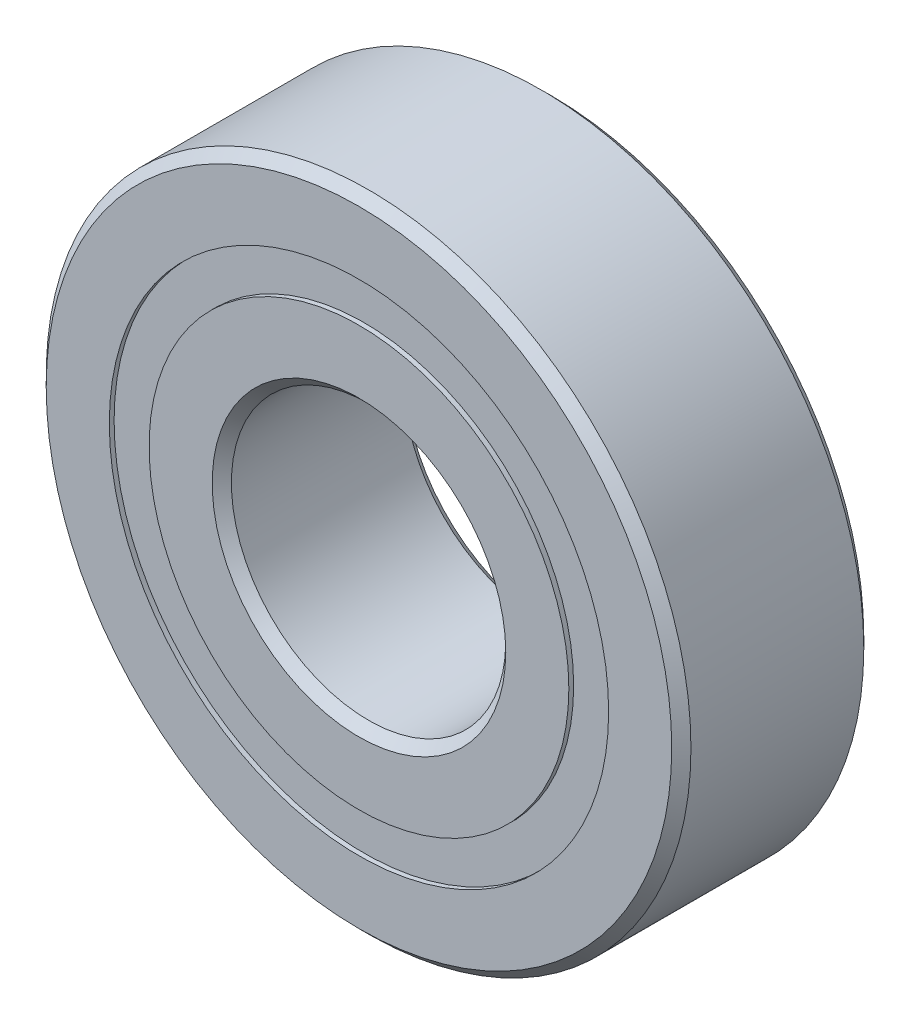
ISO-10303-21;
HEADER;
FILE_DESCRIPTION(('STEP AP214'),'2;1');
FILE_NAME('part.step','',(''),(''),'','','');
FILE_SCHEMA(('AUTOMOTIVE_DESIGN { 1 0 10303 214 1 1 1 1 }'));
ENDSEC;
DATA;
#1=APPLICATION_CONTEXT('core data for automotive mechanical design processes');
#2=APPLICATION_PROTOCOL_DEFINITION('international standard','automotive_design',2000,#1);
#3=PRODUCT_CONTEXT('',#1,'mechanical');
#4=PRODUCT('Part','Part','',(#3));
#5=PRODUCT_RELATED_PRODUCT_CATEGORY('part','',(#4));
#6=PRODUCT_DEFINITION_FORMATION('','',#4);
#7=PRODUCT_DEFINITION_CONTEXT('part definition',#1,'design');
#8=PRODUCT_DEFINITION('design','',#6,#7);
#9=PRODUCT_DEFINITION_SHAPE('','',#8);
#10=(LENGTH_UNIT() NAMED_UNIT(*) SI_UNIT(.MILLI.,.METRE.));
#11=(NAMED_UNIT(*) PLANE_ANGLE_UNIT() SI_UNIT($,.RADIAN.));
#12=(NAMED_UNIT(*) SI_UNIT($,.STERADIAN.) SOLID_ANGLE_UNIT());
#13=UNCERTAINTY_MEASURE_WITH_UNIT(LENGTH_MEASURE(1.E-05),#10,'distance_accuracy_value','');
#14=(GEOMETRIC_REPRESENTATION_CONTEXT(3) GLOBAL_UNCERTAINTY_ASSIGNED_CONTEXT((#13)) GLOBAL_UNIT_ASSIGNED_CONTEXT((#10,
#11,#12)) REPRESENTATION_CONTEXT('',''));
#15=CARTESIAN_POINT('',(0.,0.,0.));
#16=DIRECTION('',(0.,0.,1.));
#17=DIRECTION('',(1.,0.,0.));
#18=AXIS2_PLACEMENT_3D('',#15,#16,#17);
#19=CARTESIAN_POINT('',(0.,18.2005494505494,-6.65));
#20=DIRECTION('',(0.,0.,1.));
#21=DIRECTION('',(1.,0.,0.));
#22=AXIS2_PLACEMENT_3D('',#19,#20,#21);
#23=PLANE('',#22);
#24=CARTESIAN_POINT('',(0.,0.,-6.65));
#25=DIRECTION('',(0.,0.,1.));
#26=DIRECTION('',(1.,0.,0.));
#27=AXIS2_PLACEMENT_3D('',#24,#25,#26);
#28=CIRCLE('',#27,18.2005494505494);
#29=CARTESIAN_POINT('',(18.2005494505494,0.,-6.65));
#30=VERTEX_POINT('',#29);
#31=EDGE_CURVE('E59',#30,#30,#28,.T.);
#32=ORIENTED_EDGE('',*,*,#31,.F.);
#33=EDGE_LOOP('',(#32));
#34=FACE_BOUND('',#33,.T.);
#35=CARTESIAN_POINT('',(0.,0.,-6.65));
#36=DIRECTION('',(0.,0.,1.));
#37=DIRECTION('',(1.,0.,0.));
#38=AXIS2_PLACEMENT_3D('',#35,#36,#37);
#39=CIRCLE('',#38,15.2994505494506);
#40=CARTESIAN_POINT('',(15.2994505494506,0.,-6.65));
#41=VERTEX_POINT('',#40);
#42=EDGE_CURVE('E11',#41,#41,#39,.T.);
#43=ORIENTED_EDGE('',*,*,#42,.T.);
#44=EDGE_LOOP('',(#43));
#45=FACE_BOUND('',#44,.T.);
#46=ADVANCED_FACE('F45',(#34,#45),#23,.F.);
#47=CARTESIAN_POINT('',(0.,0.,7.));
#48=DIRECTION('',(0.,0.,1.));
#49=DIRECTION('',(1.,0.,0.));
#50=AXIS2_PLACEMENT_3D('',#47,#48,#49);
#51=CYLINDRICAL_SURFACE('',#50,15.2994505494506);
#52=ORIENTED_EDGE('',*,*,#42,.F.);
#53=EDGE_LOOP('',(#52));
#54=FACE_BOUND('',#53,.T.);
#55=CARTESIAN_POINT('',(0.,0.,-3.43265291781274));
#56=DIRECTION('',(0.,0.,1.));
#57=DIRECTION('',(1.,0.,0.));
#58=AXIS2_PLACEMENT_3D('',#55,#56,#57);
#59=CIRCLE('',#58,15.2994505494506);
#60=CARTESIAN_POINT('',(15.2994505494506,0.,-3.43265291781274));
#61=VERTEX_POINT('',#60);
#62=EDGE_CURVE('E51',#61,#61,#59,.T.);
#63=ORIENTED_EDGE('',*,*,#62,.T.);
#64=EDGE_LOOP('',(#63));
#65=FACE_BOUND('',#64,.T.);
#66=ADVANCED_FACE('F68',(#54,#65),#51,.F.);
#67=CARTESIAN_POINT('',(0.,18.2005494505495,-3.43265291781274));
#68=DIRECTION('',(0.,0.,-1.));
#69=DIRECTION('',(-1.,0.,0.));
#70=AXIS2_PLACEMENT_3D('',#67,#68,#69);
#71=PLANE('',#70);
#72=ORIENTED_EDGE('',*,*,#62,.F.);
#73=EDGE_LOOP('',(#72));
#74=FACE_BOUND('',#73,.T.);
#75=CARTESIAN_POINT('',(0.,0.,-3.43265291781274));
#76=DIRECTION('',(0.,0.,1.));
#77=DIRECTION('',(1.,0.,0.));
#78=AXIS2_PLACEMENT_3D('',#75,#76,#77);
#79=CIRCLE('',#78,18.2005494505495);
#80=CARTESIAN_POINT('',(18.2005494505495,0.,-3.43265291781274));
#81=VERTEX_POINT('',#80);
#82=EDGE_CURVE('E55',#81,#81,#79,.T.);
#83=ORIENTED_EDGE('',*,*,#82,.T.);
#84=EDGE_LOOP('',(#83));
#85=FACE_BOUND('',#84,.T.);
#86=ADVANCED_FACE('F72',(#74,#85),#71,.F.);
#87=CARTESIAN_POINT('',(0.,0.,7.));
#88=DIRECTION('',(0.,0.,1.));
#89=DIRECTION('',(1.,0.,0.));
#90=AXIS2_PLACEMENT_3D('',#87,#88,#89);
#91=CYLINDRICAL_SURFACE('',#90,18.2005494505494);
#92=ORIENTED_EDGE('',*,*,#82,.F.);
#93=EDGE_LOOP('',(#92));
#94=FACE_BOUND('',#93,.T.);
#95=ORIENTED_EDGE('',*,*,#31,.T.);
#96=EDGE_LOOP('',(#95));
#97=FACE_BOUND('',#96,.T.);
#98=ADVANCED_FACE('F65',(#94,#97),#91,.T.);
#99=CLOSED_SHELL('',(#46,#66,#86,#98));
#100=MANIFOLD_SOLID_BREP('B2',#99);
#101=CARTESIAN_POINT('',(0.,18.2005494505495,6.65));
#102=DIRECTION('',(0.,0.,-1.));
#103=DIRECTION('',(-1.,0.,0.));
#104=AXIS2_PLACEMENT_3D('',#101,#102,#103);
#105=PLANE('',#104);
#106=CARTESIAN_POINT('',(0.,0.,6.65));
#107=DIRECTION('',(0.,0.,1.));
#108=DIRECTION('',(1.,0.,0.));
#109=AXIS2_PLACEMENT_3D('',#106,#107,#108);
#110=CIRCLE('',#109,15.2994505494506);
#111=CARTESIAN_POINT('',(15.2994505494506,0.,6.65));
#112=VERTEX_POINT('',#111);
#113=EDGE_CURVE('E44',#112,#112,#110,.T.);
#114=ORIENTED_EDGE('',*,*,#113,.F.);
#115=EDGE_LOOP('',(#114));
#116=FACE_BOUND('',#115,.T.);
#117=CARTESIAN_POINT('',(0.,0.,6.65));
#118=DIRECTION('',(0.,0.,1.));
#119=DIRECTION('',(1.,0.,0.));
#120=AXIS2_PLACEMENT_3D('',#117,#118,#119);
#121=CIRCLE('',#120,18.2005494505495);
#122=CARTESIAN_POINT('',(18.2005494505495,0.,6.65));
#123=VERTEX_POINT('',#122);
#124=EDGE_CURVE('E126',#123,#123,#121,.T.);
#125=ORIENTED_EDGE('',*,*,#124,.T.);
#126=EDGE_LOOP('',(#125));
#127=FACE_BOUND('',#126,.T.);
#128=ADVANCED_FACE('F112',(#116,#127),#105,.F.);
#129=CARTESIAN_POINT('',(0.,0.,7.));
#130=DIRECTION('',(0.,0.,1.));
#131=DIRECTION('',(1.,0.,0.));
#132=AXIS2_PLACEMENT_3D('',#129,#130,#131);
#133=CYLINDRICAL_SURFACE('',#132,15.2994505494506);
#134=CARTESIAN_POINT('',(0.,0.,3.43265291781274));
#135=DIRECTION('',(0.,0.,1.));
#136=DIRECTION('',(1.,0.,0.));
#137=AXIS2_PLACEMENT_3D('',#134,#135,#136);
#138=CIRCLE('',#137,15.2994505494506);
#139=CARTESIAN_POINT('',(15.2994505494506,0.,3.43265291781274));
#140=VERTEX_POINT('',#139);
#141=EDGE_CURVE('E118',#140,#140,#138,.T.);
#142=ORIENTED_EDGE('',*,*,#141,.F.);
#143=EDGE_LOOP('',(#142));
#144=FACE_BOUND('',#143,.T.);
#145=ORIENTED_EDGE('',*,*,#113,.T.);
#146=EDGE_LOOP('',(#145));
#147=FACE_BOUND('',#146,.T.);
#148=ADVANCED_FACE('F141',(#144,#147),#133,.F.);
#149=CARTESIAN_POINT('',(0.,18.2005494505495,3.43265291781274));
#150=DIRECTION('',(0.,0.,1.));
#151=DIRECTION('',(1.,0.,0.));
#152=AXIS2_PLACEMENT_3D('',#149,#150,#151);
#153=PLANE('',#152);
#154=CARTESIAN_POINT('',(0.,0.,3.43265291781274));
#155=DIRECTION('',(0.,0.,1.));
#156=DIRECTION('',(1.,0.,0.));
#157=AXIS2_PLACEMENT_3D('',#154,#155,#156);
#158=CIRCLE('',#157,18.2005494505495);
#159=CARTESIAN_POINT('',(18.2005494505495,0.,3.43265291781274));
#160=VERTEX_POINT('',#159);
#161=EDGE_CURVE('E122',#160,#160,#158,.T.);
#162=ORIENTED_EDGE('',*,*,#161,.F.);
#163=EDGE_LOOP('',(#162));
#164=FACE_BOUND('',#163,.T.);
#165=ORIENTED_EDGE('',*,*,#141,.T.);
#166=EDGE_LOOP('',(#165));
#167=FACE_BOUND('',#166,.T.);
#168=ADVANCED_FACE('F136',(#164,#167),#153,.F.);
#169=CARTESIAN_POINT('',(0.,0.,7.));
#170=DIRECTION('',(0.,0.,1.));
#171=DIRECTION('',(1.,0.,0.));
#172=AXIS2_PLACEMENT_3D('',#169,#170,#171);
#173=CYLINDRICAL_SURFACE('',#172,18.2005494505495);
#174=ORIENTED_EDGE('',*,*,#124,.F.);
#175=EDGE_LOOP('',(#174));
#176=FACE_BOUND('',#175,.T.);
#177=ORIENTED_EDGE('',*,*,#161,.T.);
#178=EDGE_LOOP('',(#177));
#179=FACE_BOUND('',#178,.T.);
#180=ADVANCED_FACE('F133',(#176,#179),#173,.T.);
#181=CLOSED_SHELL('',(#128,#148,#168,#180));
#182=MANIFOLD_SOLID_BREP('B6',#181);
#183=CARTESIAN_POINT('',(-8.37499999999982,14.5059255133895,0.));
#184=DIRECTION('',(0.,0.,1.));
#185=DIRECTION('',(-0.499999999999989,0.866025403784445,0.));
#186=AXIS2_PLACEMENT_3D('',#183,#184,#185);
#187=SPHERICAL_SURFACE('',#186,3.43265291781274);
#188=CARTESIAN_POINT('',(-8.37499999999982,14.5059255133895,3.43265291781274));
#189=VERTEX_POINT('',#188);
#190=VERTEX_LOOP('',#189);
#191=FACE_BOUND('',#190,.T.);
#192=ADVANCED_FACE('F179',(#191),#187,.T.);
#193=CLOSED_SHELL('',(#192));
#194=MANIFOLD_SOLID_BREP('B39',#193);
#195=CARTESIAN_POINT('',(-14.5059255133893,8.37500000000017,0.));
#196=DIRECTION('',(0.,0.,1.));
#197=DIRECTION('',(-0.866025403784433,0.50000000000001,0.));
#198=AXIS2_PLACEMENT_3D('',#195,#196,#197);
#199=SPHERICAL_SURFACE('',#198,3.43265291781274);
#200=CARTESIAN_POINT('',(-14.5059255133893,8.37500000000017,3.43265291781274));
#201=VERTEX_POINT('',#200);
#202=VERTEX_LOOP('',#201);
#203=FACE_BOUND('',#202,.T.);
#204=ADVANCED_FACE('F199',(#203),#199,.T.);
#205=CLOSED_SHELL('',(#204));
#206=MANIFOLD_SOLID_BREP('B108',#205);
#207=CARTESIAN_POINT('',(-16.75,1.75446937276867E-13,0.));
#208=DIRECTION('',(0.,0.,1.));
#209=DIRECTION('',(-1.,0.,0.));
#210=AXIS2_PLACEMENT_3D('',#207,#208,#209);
#211=SPHERICAL_SURFACE('',#210,3.43265291781274);
#212=CARTESIAN_POINT('',(-16.75,1.75446937276867E-13,3.43265291781274));
#213=VERTEX_POINT('',#212);
#214=VERTEX_LOOP('',#213);
#215=FACE_BOUND('',#214,.T.);
#216=ADVANCED_FACE('F219',(#215),#211,.T.);
#217=CLOSED_SHELL('',(#216));
#218=MANIFOLD_SOLID_BREP('B175',#217);
#219=CARTESIAN_POINT('',(-14.5059255133894,-8.37499999999986,0.));
#220=DIRECTION('',(0.,0.,1.));
#221=DIRECTION('',(-0.866025403784443,-0.499999999999992,0.));
#222=AXIS2_PLACEMENT_3D('',#219,#220,#221);
#223=SPHERICAL_SURFACE('',#222,3.43265291781274);
#224=CARTESIAN_POINT('',(-14.5059255133894,-8.37499999999986,3.43265291781274));
#225=VERTEX_POINT('',#224);
#226=VERTEX_LOOP('',#225);
#227=FACE_BOUND('',#226,.T.);
#228=ADVANCED_FACE('F239',(#227),#223,.T.);
#229=CLOSED_SHELL('',(#228));
#230=MANIFOLD_SOLID_BREP('B195',#229);
#231=CARTESIAN_POINT('',(-8.37500000000012,-14.5059255133893,0.));
#232=DIRECTION('',(0.,0.,1.));
#233=DIRECTION('',(-0.500000000000007,-0.866025403784435,0.));
#234=AXIS2_PLACEMENT_3D('',#231,#232,#233);
#235=SPHERICAL_SURFACE('',#234,3.43265291781274);
#236=CARTESIAN_POINT('',(-8.37500000000012,-14.5059255133893,3.43265291781274));
#237=VERTEX_POINT('',#236);
#238=VERTEX_LOOP('',#237);
#239=FACE_BOUND('',#238,.T.);
#240=ADVANCED_FACE('F259',(#239),#235,.T.);
#241=CLOSED_SHELL('',(#240));
#242=MANIFOLD_SOLID_BREP('B215',#241);
#243=CARTESIAN_POINT('',(-1.16964624851245E-13,-16.75,0.));
#244=DIRECTION('',(0.,0.,1.));
#245=DIRECTION('',(0.,-1.,0.));
#246=AXIS2_PLACEMENT_3D('',#243,#244,#245);
#247=SPHERICAL_SURFACE('',#246,3.43265291781274);
#248=CARTESIAN_POINT('',(-1.16964624851245E-13,-16.75,3.43265291781274));
#249=VERTEX_POINT('',#248);
#250=VERTEX_LOOP('',#249);
#251=FACE_BOUND('',#250,.T.);
#252=ADVANCED_FACE('F279',(#251),#247,.T.);
#253=CLOSED_SHELL('',(#252));
#254=MANIFOLD_SOLID_BREP('B235',#253);
#255=CARTESIAN_POINT('',(8.37499999999991,-14.5059255133894,0.));
#256=DIRECTION('',(0.,0.,1.));
#257=DIRECTION('',(0.499999999999995,-0.866025403784442,0.));
#258=AXIS2_PLACEMENT_3D('',#255,#256,#257);
#259=SPHERICAL_SURFACE('',#258,3.43265291781274);
#260=CARTESIAN_POINT('',(8.37499999999991,-14.5059255133894,3.43265291781274));
#261=VERTEX_POINT('',#260);
#262=VERTEX_LOOP('',#261);
#263=FACE_BOUND('',#262,.T.);
#264=ADVANCED_FACE('F299',(#263),#259,.T.);
#265=CLOSED_SHELL('',(#264));
#266=MANIFOLD_SOLID_BREP('B255',#265);
#267=CARTESIAN_POINT('',(14.5059255133893,-8.37500000000007,0.));
#268=DIRECTION('',(0.,0.,1.));
#269=DIRECTION('',(0.866025403784436,-0.500000000000004,0.));
#270=AXIS2_PLACEMENT_3D('',#267,#268,#269);
#271=SPHERICAL_SURFACE('',#270,3.43265291781274);
#272=CARTESIAN_POINT('',(14.5059255133893,-8.37500000000007,3.43265291781274));
#273=VERTEX_POINT('',#272);
#274=VERTEX_LOOP('',#273);
#275=FACE_BOUND('',#274,.T.);
#276=ADVANCED_FACE('F319',(#275),#271,.T.);
#277=CLOSED_SHELL('',(#276));
#278=MANIFOLD_SOLID_BREP('B275',#277);
#279=CARTESIAN_POINT('',(16.75,0.,0.));
#280=DIRECTION('',(0.,0.,1.));
#281=DIRECTION('',(1.,0.,0.));
#282=AXIS2_PLACEMENT_3D('',#279,#280,#281);
#283=SPHERICAL_SURFACE('',#282,3.43265291781274);
#284=CARTESIAN_POINT('',(16.75,0.,3.43265291781274));
#285=VERTEX_POINT('',#284);
#286=VERTEX_LOOP('',#285);
#287=FACE_BOUND('',#286,.T.);
#288=ADVANCED_FACE('F339',(#287),#283,.T.);
#289=CLOSED_SHELL('',(#288));
#290=MANIFOLD_SOLID_BREP('B295',#289);
#291=CARTESIAN_POINT('',(14.5059255133894,8.37499999999997,0.));
#292=DIRECTION('',(0.,0.,1.));
#293=DIRECTION('',(0.86602540378444,0.499999999999998,0.));
#294=AXIS2_PLACEMENT_3D('',#291,#292,#293);
#295=SPHERICAL_SURFACE('',#294,3.43265291781274);
#296=CARTESIAN_POINT('',(14.5059255133894,8.37499999999997,3.43265291781274));
#297=VERTEX_POINT('',#296);
#298=VERTEX_LOOP('',#297);
#299=FACE_BOUND('',#298,.T.);
#300=ADVANCED_FACE('F359',(#299),#295,.T.);
#301=CLOSED_SHELL('',(#300));
#302=MANIFOLD_SOLID_BREP('B315',#301);
#303=CARTESIAN_POINT('',(8.37500000000002,14.5059255133893,0.));
#304=DIRECTION('',(0.,0.,1.));
#305=DIRECTION('',(0.500000000000001,0.866025403784438,0.));
#306=AXIS2_PLACEMENT_3D('',#303,#304,#305);
#307=SPHERICAL_SURFACE('',#306,3.43265291781274);
#308=CARTESIAN_POINT('',(8.37500000000002,14.5059255133893,3.43265291781274));
#309=VERTEX_POINT('',#308);
#310=VERTEX_LOOP('',#309);
#311=FACE_BOUND('',#310,.T.);
#312=ADVANCED_FACE('F379',(#311),#307,.T.);
#313=CLOSED_SHELL('',(#312));
#314=MANIFOLD_SOLID_BREP('B335',#313);
#315=CARTESIAN_POINT('',(0.,16.75,0.));
#316=DIRECTION('',(0.,0.,1.));
#317=DIRECTION('',(0.,1.,0.));
#318=AXIS2_PLACEMENT_3D('',#315,#316,#317);
#319=SPHERICAL_SURFACE('',#318,3.43265291781274);
#320=CARTESIAN_POINT('',(0.,16.75,3.43265291781274));
#321=VERTEX_POINT('',#320);
#322=VERTEX_LOOP('',#321);
#323=FACE_BOUND('',#322,.T.);
#324=ADVANCED_FACE('F401',(#323),#319,.T.);
#325=CLOSED_SHELL('',(#324));
#326=MANIFOLD_SOLID_BREP('B355',#325);
#327=CARTESIAN_POINT('',(0.,15.2994505494506,7.));
#328=DIRECTION('',(0.,0.,-1.));
#329=DIRECTION('',(-1.,0.,0.));
#330=AXIS2_PLACEMENT_3D('',#327,#328,#329);
#331=PLANE('',#330);
#332=CARTESIAN_POINT('',(0.,0.,7.));
#333=DIRECTION('',(0.,0.,1.));
#334=DIRECTION('',(1.,0.,0.));
#335=AXIS2_PLACEMENT_3D('',#332,#333,#334);
#336=CIRCLE('',#335,10.7);
#337=CARTESIAN_POINT('',(10.7,0.,7.));
#338=VERTEX_POINT('',#337);
#339=EDGE_CURVE('E448',#338,#338,#336,.T.);
#340=ORIENTED_EDGE('',*,*,#339,.F.);
#341=EDGE_LOOP('',(#340));
#342=FACE_BOUND('',#341,.T.);
#343=CARTESIAN_POINT('',(0.,0.,7.));
#344=DIRECTION('',(0.,0.,1.));
#345=DIRECTION('',(1.,0.,0.));
#346=AXIS2_PLACEMENT_3D('',#343,#344,#345);
#347=CIRCLE('',#346,15.2994505494506);
#348=CARTESIAN_POINT('',(15.2994505494506,0.,7.));
#349=VERTEX_POINT('',#348);
#350=EDGE_CURVE('E400',#349,#349,#347,.T.);
#351=ORIENTED_EDGE('',*,*,#350,.T.);
#352=EDGE_LOOP('',(#351));
#353=FACE_BOUND('',#352,.T.);
#354=ADVANCED_FACE('F420',(#342,#353),#331,.F.);
#355=CARTESIAN_POINT('',(0.,0.,7.));
#356=DIRECTION('',(0.,0.,1.));
#357=DIRECTION('',(1.,0.,0.));
#358=AXIS2_PLACEMENT_3D('',#355,#356,#357);
#359=CYLINDRICAL_SURFACE('',#358,15.2994505494506);
#360=ORIENTED_EDGE('',*,*,#350,.F.);
#361=EDGE_LOOP('',(#360));
#362=FACE_BOUND('',#361,.T.);
#363=CARTESIAN_POINT('',(0.,0.,3.11111111111111));
#364=DIRECTION('',(0.,0.,1.));
#365=DIRECTION('',(1.,0.,0.));
#366=AXIS2_PLACEMENT_3D('',#363,#364,#365);
#367=CIRCLE('',#366,15.2994505494506);
#368=CARTESIAN_POINT('',(15.2994505494506,0.,3.11111111111111));
#369=VERTEX_POINT('',#368);
#370=EDGE_CURVE('E426',#369,#369,#367,.T.);
#371=ORIENTED_EDGE('',*,*,#370,.T.);
#372=EDGE_LOOP('',(#371));
#373=FACE_BOUND('',#372,.T.);
#374=ADVANCED_FACE('F455',(#362,#373),#359,.T.);
#375=CARTESIAN_POINT('',(0.,0.,0.));
#376=DIRECTION('',(0.,0.,1.));
#377=DIRECTION('',(1.,0.,0.));
#378=AXIS2_PLACEMENT_3D('',#375,#376,#377);
#379=TOROIDAL_SURFACE('',#378,16.75,3.43265291781274);
#380=ORIENTED_EDGE('',*,*,#370,.F.);
#381=EDGE_LOOP('',(#380));
#382=FACE_BOUND('',#381,.T.);
#383=CARTESIAN_POINT('',(0.,0.,-3.11111111111112));
#384=DIRECTION('',(0.,0.,1.));
#385=DIRECTION('',(1.,0.,0.));
#386=AXIS2_PLACEMENT_3D('',#383,#384,#385);
#387=CIRCLE('',#386,15.2994505494506);
#388=CARTESIAN_POINT('',(15.2994505494506,0.,-3.11111111111112));
#389=VERTEX_POINT('',#388);
#390=EDGE_CURVE('E430',#389,#389,#387,.T.);
#391=ORIENTED_EDGE('',*,*,#390,.T.);
#392=EDGE_LOOP('',(#391));
#393=FACE_BOUND('',#392,.T.);
#394=ADVANCED_FACE('F459',(#382,#393),#379,.F.);
#395=CARTESIAN_POINT('',(0.,0.,7.));
#396=DIRECTION('',(0.,0.,1.));
#397=DIRECTION('',(1.,0.,0.));
#398=AXIS2_PLACEMENT_3D('',#395,#396,#397);
#399=CYLINDRICAL_SURFACE('',#398,15.2994505494506);
#400=ORIENTED_EDGE('',*,*,#390,.F.);
#401=EDGE_LOOP('',(#400));
#402=FACE_BOUND('',#401,.T.);
#403=CARTESIAN_POINT('',(0.,0.,-7.));
#404=DIRECTION('',(0.,0.,1.));
#405=DIRECTION('',(1.,0.,0.));
#406=AXIS2_PLACEMENT_3D('',#403,#404,#405);
#407=CIRCLE('',#406,15.2994505494506);
#408=CARTESIAN_POINT('',(15.2994505494506,0.,-7.));
#409=VERTEX_POINT('',#408);
#410=EDGE_CURVE('E434',#409,#409,#407,.T.);
#411=ORIENTED_EDGE('',*,*,#410,.T.);
#412=EDGE_LOOP('',(#411));
#413=FACE_BOUND('',#412,.T.);
#414=ADVANCED_FACE('F464',(#402,#413),#399,.T.);
#415=CARTESIAN_POINT('',(0.,10.7,-7.));
#416=DIRECTION('',(0.,0.,1.));
#417=DIRECTION('',(1.,0.,0.));
#418=AXIS2_PLACEMENT_3D('',#415,#416,#417);
#419=PLANE('',#418);
#420=ORIENTED_EDGE('',*,*,#410,.F.);
#421=EDGE_LOOP('',(#420));
#422=FACE_BOUND('',#421,.T.);
#423=CARTESIAN_POINT('',(0.,0.,-7.));
#424=DIRECTION('',(0.,0.,1.));
#425=DIRECTION('',(1.,0.,0.));
#426=AXIS2_PLACEMENT_3D('',#423,#424,#425);
#427=CIRCLE('',#426,10.7);
#428=CARTESIAN_POINT('',(10.7,0.,-7.));
#429=VERTEX_POINT('',#428);
#430=EDGE_CURVE('E439',#429,#429,#427,.T.);
#431=ORIENTED_EDGE('',*,*,#430,.T.);
#432=EDGE_LOOP('',(#431));
#433=FACE_BOUND('',#432,.T.);
#434=ADVANCED_FACE('F470',(#422,#433),#419,.F.);
#435=CARTESIAN_POINT('',(0.,0.,-6.3));
#436=DIRECTION('',(0.,0.,-1.));
#437=DIRECTION('',(-1.,0.,0.));
#438=AXIS2_PLACEMENT_3D('',#435,#436,#437);
#439=CONICAL_SURFACE('',#438,10.,0.785398163397446);
#440=ORIENTED_EDGE('',*,*,#430,.F.);
#441=EDGE_LOOP('',(#440));
#442=FACE_BOUND('',#441,.T.);
#443=CARTESIAN_POINT('',(0.,0.,-6.3));
#444=DIRECTION('',(0.,0.,1.));
#445=DIRECTION('',(1.,0.,0.));
#446=AXIS2_PLACEMENT_3D('',#443,#444,#445);
#447=CIRCLE('',#446,10.);
#448=CARTESIAN_POINT('',(10.,0.,-6.3));
#449=VERTEX_POINT('',#448);
#450=EDGE_CURVE('E442',#449,#449,#447,.T.);
#451=ORIENTED_EDGE('',*,*,#450,.T.);
#452=EDGE_LOOP('',(#451));
#453=FACE_BOUND('',#452,.T.);
#454=ADVANCED_FACE('F474',(#442,#453),#439,.F.);
#455=CARTESIAN_POINT('',(0.,0.,7.));
#456=DIRECTION('',(0.,0.,1.));
#457=DIRECTION('',(1.,0.,0.));
#458=AXIS2_PLACEMENT_3D('',#455,#456,#457);
#459=CYLINDRICAL_SURFACE('',#458,10.);
#460=ORIENTED_EDGE('',*,*,#450,.F.);
#461=EDGE_LOOP('',(#460));
#462=FACE_BOUND('',#461,.T.);
#463=CARTESIAN_POINT('',(0.,0.,6.3));
#464=DIRECTION('',(0.,0.,1.));
#465=DIRECTION('',(1.,0.,0.));
#466=AXIS2_PLACEMENT_3D('',#463,#464,#465);
#467=CIRCLE('',#466,10.);
#468=CARTESIAN_POINT('',(10.,0.,6.3));
#469=VERTEX_POINT('',#468);
#470=EDGE_CURVE('E445',#469,#469,#467,.T.);
#471=ORIENTED_EDGE('',*,*,#470,.T.);
#472=EDGE_LOOP('',(#471));
#473=FACE_BOUND('',#472,.T.);
#474=ADVANCED_FACE('F478',(#462,#473),#459,.F.);
#475=CARTESIAN_POINT('',(0.,0.,7.));
#476=DIRECTION('',(0.,0.,1.));
#477=DIRECTION('',(1.,0.,0.));
#478=AXIS2_PLACEMENT_3D('',#475,#476,#477);
#479=CONICAL_SURFACE('',#478,10.7,0.78539816339745);
#480=ORIENTED_EDGE('',*,*,#470,.F.);
#481=EDGE_LOOP('',(#480));
#482=FACE_BOUND('',#481,.T.);
#483=ORIENTED_EDGE('',*,*,#339,.T.);
#484=EDGE_LOOP('',(#483));
#485=FACE_BOUND('',#484,.T.);
#486=ADVANCED_FACE('F452',(#482,#485),#479,.F.);
#487=CLOSED_SHELL('',(#354,#374,#394,#414,#434,#454,#474,#486));
#488=MANIFOLD_SOLID_BREP('B375',#487);
#489=CARTESIAN_POINT('',(0.,0.,6.3));
#490=DIRECTION('',(0.,0.,-1.));
#491=DIRECTION('',(-1.,0.,0.));
#492=AXIS2_PLACEMENT_3D('',#489,#490,#491);
#493=CONICAL_SURFACE('',#492,23.5,0.785398163397445);
#494=CARTESIAN_POINT('',(0.,0.,7.));
#495=DIRECTION('',(0.,0.,1.));
#496=DIRECTION('',(1.,0.,0.));
#497=AXIS2_PLACEMENT_3D('',#494,#495,#496);
#498=CIRCLE('',#497,22.8);
#499=CARTESIAN_POINT('',(22.8,0.,7.));
#500=VERTEX_POINT('',#499);
#501=EDGE_CURVE('E569',#500,#500,#498,.T.);
#502=ORIENTED_EDGE('',*,*,#501,.F.);
#503=EDGE_LOOP('',(#502));
#504=FACE_BOUND('',#503,.T.);
#505=CARTESIAN_POINT('',(0.,0.,6.3));
#506=DIRECTION('',(0.,0.,1.));
#507=DIRECTION('',(1.,0.,0.));
#508=AXIS2_PLACEMENT_3D('',#505,#506,#507);
#509=CIRCLE('',#508,23.5);
#510=CARTESIAN_POINT('',(23.5,0.,6.3));
#511=VERTEX_POINT('',#510);
#512=EDGE_CURVE('E419',#511,#511,#509,.T.);
#513=ORIENTED_EDGE('',*,*,#512,.T.);
#514=EDGE_LOOP('',(#513));
#515=FACE_BOUND('',#514,.T.);
#516=ADVANCED_FACE('F541',(#504,#515),#493,.T.);
#517=CARTESIAN_POINT('',(0.,0.,7.));
#518=DIRECTION('',(0.,0.,1.));
#519=DIRECTION('',(1.,0.,0.));
#520=AXIS2_PLACEMENT_3D('',#517,#518,#519);
#521=CYLINDRICAL_SURFACE('',#520,23.5);
#522=ORIENTED_EDGE('',*,*,#512,.F.);
#523=EDGE_LOOP('',(#522));
#524=FACE_BOUND('',#523,.T.);
#525=CARTESIAN_POINT('',(0.,0.,-6.3));
#526=DIRECTION('',(0.,0.,1.));
#527=DIRECTION('',(1.,0.,0.));
#528=AXIS2_PLACEMENT_3D('',#525,#526,#527);
#529=CIRCLE('',#528,23.5);
#530=CARTESIAN_POINT('',(23.5,0.,-6.3));
#531=VERTEX_POINT('',#530);
#532=EDGE_CURVE('E547',#531,#531,#529,.T.);
#533=ORIENTED_EDGE('',*,*,#532,.T.);
#534=EDGE_LOOP('',(#533));
#535=FACE_BOUND('',#534,.T.);
#536=ADVANCED_FACE('F576',(#524,#535),#521,.T.);
#537=CARTESIAN_POINT('',(0.,0.,-7.));
#538=DIRECTION('',(0.,0.,1.));
#539=DIRECTION('',(1.,0.,0.));
#540=AXIS2_PLACEMENT_3D('',#537,#538,#539);
#541=CONICAL_SURFACE('',#540,22.8,0.785398163397446);
#542=ORIENTED_EDGE('',*,*,#532,.F.);
#543=EDGE_LOOP('',(#542));
#544=FACE_BOUND('',#543,.T.);
#545=CARTESIAN_POINT('',(0.,0.,-7.));
#546=DIRECTION('',(0.,0.,1.));
#547=DIRECTION('',(1.,0.,0.));
#548=AXIS2_PLACEMENT_3D('',#545,#546,#547);
#549=CIRCLE('',#548,22.8);
#550=CARTESIAN_POINT('',(22.8,0.,-7.));
#551=VERTEX_POINT('',#550);
#552=EDGE_CURVE('E551',#551,#551,#549,.T.);
#553=ORIENTED_EDGE('',*,*,#552,.T.);
#554=EDGE_LOOP('',(#553));
#555=FACE_BOUND('',#554,.T.);
#556=ADVANCED_FACE('F580',(#544,#555),#541,.T.);
#557=CARTESIAN_POINT('',(0.,22.8,-7.));
#558=DIRECTION('',(0.,0.,1.));
#559=DIRECTION('',(1.,0.,0.));
#560=AXIS2_PLACEMENT_3D('',#557,#558,#559);
#561=PLANE('',#560);
#562=ORIENTED_EDGE('',*,*,#552,.F.);
#563=EDGE_LOOP('',(#562));
#564=FACE_BOUND('',#563,.T.);
#565=CARTESIAN_POINT('',(0.,0.,-7.));
#566=DIRECTION('',(0.,0.,1.));
#567=DIRECTION('',(1.,0.,0.));
#568=AXIS2_PLACEMENT_3D('',#565,#566,#567);
#569=CIRCLE('',#568,18.2005494505495);
#570=CARTESIAN_POINT('',(18.2005494505495,0.,-7.));
#571=VERTEX_POINT('',#570);
#572=EDGE_CURVE('E555',#571,#571,#569,.T.);
#573=ORIENTED_EDGE('',*,*,#572,.T.);
#574=EDGE_LOOP('',(#573));
#575=FACE_BOUND('',#574,.T.);
#576=ADVANCED_FACE('F585',(#564,#575),#561,.F.);
#577=CARTESIAN_POINT('',(0.,0.,7.));
#578=DIRECTION('',(0.,0.,1.));
#579=DIRECTION('',(1.,0.,0.));
#580=AXIS2_PLACEMENT_3D('',#577,#578,#579);
#581=CYLINDRICAL_SURFACE('',#580,18.2005494505495);
#582=ORIENTED_EDGE('',*,*,#572,.F.);
#583=EDGE_LOOP('',(#582));
#584=FACE_BOUND('',#583,.T.);
#585=CARTESIAN_POINT('',(0.,0.,-3.11111111111111));
#586=DIRECTION('',(0.,0.,1.));
#587=DIRECTION('',(1.,0.,0.));
#588=AXIS2_PLACEMENT_3D('',#585,#586,#587);
#589=CIRCLE('',#588,18.2005494505495);
#590=CARTESIAN_POINT('',(18.2005494505495,0.,-3.11111111111111));
#591=VERTEX_POINT('',#590);
#592=EDGE_CURVE('E560',#591,#591,#589,.T.);
#593=ORIENTED_EDGE('',*,*,#592,.T.);
#594=EDGE_LOOP('',(#593));
#595=FACE_BOUND('',#594,.T.);
#596=ADVANCED_FACE('F591',(#584,#595),#581,.F.);
#597=CARTESIAN_POINT('',(0.,0.,0.));
#598=DIRECTION('',(0.,0.,1.));
#599=DIRECTION('',(1.,0.,0.));
#600=AXIS2_PLACEMENT_3D('',#597,#598,#599);
#601=TOROIDAL_SURFACE('',#600,16.75,3.43265291781274);
#602=ORIENTED_EDGE('',*,*,#592,.F.);
#603=EDGE_LOOP('',(#602));
#604=FACE_BOUND('',#603,.T.);
#605=CARTESIAN_POINT('',(0.,0.,3.11111111111111));
#606=DIRECTION('',(0.,0.,1.));
#607=DIRECTION('',(1.,0.,0.));
#608=AXIS2_PLACEMENT_3D('',#605,#606,#607);
#609=CIRCLE('',#608,18.2005494505495);
#610=CARTESIAN_POINT('',(18.2005494505495,0.,3.11111111111111));
#611=VERTEX_POINT('',#610);
#612=EDGE_CURVE('E563',#611,#611,#609,.T.);
#613=ORIENTED_EDGE('',*,*,#612,.T.);
#614=EDGE_LOOP('',(#613));
#615=FACE_BOUND('',#614,.T.);
#616=ADVANCED_FACE('F595',(#604,#615),#601,.F.);
#617=CARTESIAN_POINT('',(0.,0.,7.));
#618=DIRECTION('',(0.,0.,1.));
#619=DIRECTION('',(1.,0.,0.));
#620=AXIS2_PLACEMENT_3D('',#617,#618,#619);
#621=CYLINDRICAL_SURFACE('',#620,18.2005494505495);
#622=ORIENTED_EDGE('',*,*,#612,.F.);
#623=EDGE_LOOP('',(#622));
#624=FACE_BOUND('',#623,.T.);
#625=CARTESIAN_POINT('',(0.,0.,7.));
#626=DIRECTION('',(0.,0.,1.));
#627=DIRECTION('',(1.,0.,0.));
#628=AXIS2_PLACEMENT_3D('',#625,#626,#627);
#629=CIRCLE('',#628,18.2005494505495);
#630=CARTESIAN_POINT('',(18.2005494505495,0.,7.));
#631=VERTEX_POINT('',#630);
#632=EDGE_CURVE('E566',#631,#631,#629,.T.);
#633=ORIENTED_EDGE('',*,*,#632,.T.);
#634=EDGE_LOOP('',(#633));
#635=FACE_BOUND('',#634,.T.);
#636=ADVANCED_FACE('F599',(#624,#635),#621,.F.);
#637=CARTESIAN_POINT('',(0.,22.8,7.));
#638=DIRECTION('',(0.,0.,-1.));
#639=DIRECTION('',(-1.,0.,0.));
#640=AXIS2_PLACEMENT_3D('',#637,#638,#639);
#641=PLANE('',#640);
#642=ORIENTED_EDGE('',*,*,#632,.F.);
#643=EDGE_LOOP('',(#642));
#644=FACE_BOUND('',#643,.T.);
#645=ORIENTED_EDGE('',*,*,#501,.T.);
#646=EDGE_LOOP('',(#645));
#647=FACE_BOUND('',#646,.T.);
#648=ADVANCED_FACE('F573',(#644,#647),#641,.F.);
#649=CLOSED_SHELL('',(#516,#536,#556,#576,#596,#616,#636,#648));
#650=MANIFOLD_SOLID_BREP('B395',#649);
#651=ADVANCED_BREP_SHAPE_REPRESENTATION('',(#18,#100,#182,#194,#206,#218,#230,#242,#254,#266,
#278,#290,#302,#314,#326,#488,#650),#14);
#652=SHAPE_DEFINITION_REPRESENTATION(#9,#651);
ENDSEC;
END-ISO-10303-21;
